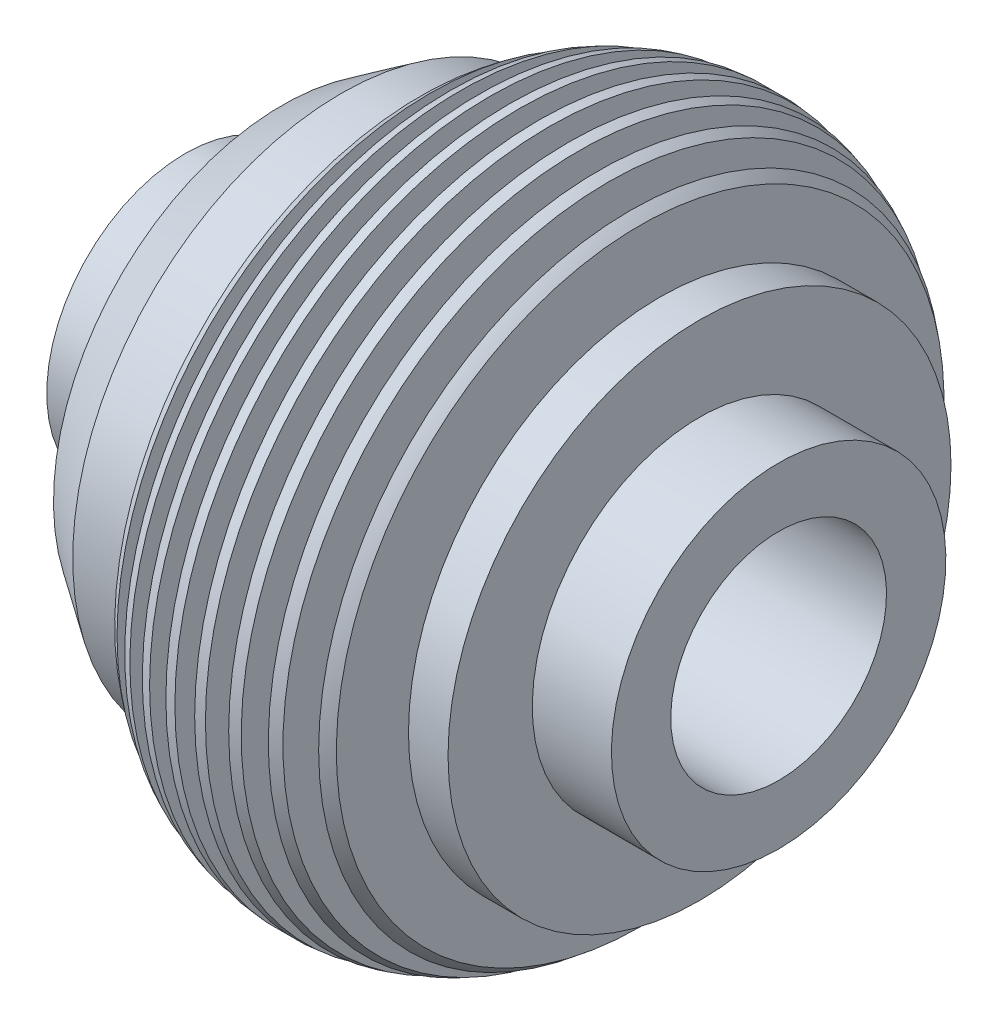
ISO-10303-21;
HEADER;
FILE_DESCRIPTION(('STEP AP214'),'2;1');
FILE_NAME('part.step','',(''),(''),'','','');
FILE_SCHEMA(('AUTOMOTIVE_DESIGN { 1 0 10303 214 1 1 1 1 }'));
ENDSEC;
DATA;
#1=APPLICATION_CONTEXT('core data for automotive mechanical design processes');
#2=APPLICATION_PROTOCOL_DEFINITION('international standard','automotive_design',2000,#1);
#3=PRODUCT_CONTEXT('',#1,'mechanical');
#4=PRODUCT('Part','Part','',(#3));
#5=PRODUCT_RELATED_PRODUCT_CATEGORY('part','',(#4));
#6=PRODUCT_DEFINITION_FORMATION('','',#4);
#7=PRODUCT_DEFINITION_CONTEXT('part definition',#1,'design');
#8=PRODUCT_DEFINITION('design','',#6,#7);
#9=PRODUCT_DEFINITION_SHAPE('','',#8);
#10=(LENGTH_UNIT() NAMED_UNIT(*) SI_UNIT(.MILLI.,.METRE.));
#11=(NAMED_UNIT(*) PLANE_ANGLE_UNIT() SI_UNIT($,.RADIAN.));
#12=(NAMED_UNIT(*) SI_UNIT($,.STERADIAN.) SOLID_ANGLE_UNIT());
#13=UNCERTAINTY_MEASURE_WITH_UNIT(LENGTH_MEASURE(1.E-05),#10,'distance_accuracy_value','');
#14=(GEOMETRIC_REPRESENTATION_CONTEXT(3) GLOBAL_UNCERTAINTY_ASSIGNED_CONTEXT((#13)) GLOBAL_UNIT_ASSIGNED_CONTEXT((#10,
#11,#12)) REPRESENTATION_CONTEXT('',''));
#15=CARTESIAN_POINT('',(0.,0.,0.));
#16=DIRECTION('',(0.,0.,1.));
#17=DIRECTION('',(1.,0.,0.));
#18=AXIS2_PLACEMENT_3D('',#15,#16,#17);
#19=CARTESIAN_POINT('',(-25.4836050641212,0.,0.));
#20=DIRECTION('',(1.,0.,0.));
#21=DIRECTION('',(0.,1.,0.));
#22=AXIS2_PLACEMENT_3D('',#19,#20,#21);
#23=PLANE('',#22);
#24=CARTESIAN_POINT('',(-25.4836050641212,-15.,0.));
#25=DIRECTION('',(-1.,0.,0.));
#26=DIRECTION('',(0.,-1.,0.));
#27=AXIS2_PLACEMENT_3D('',#24,#25,#26);
#28=CIRCLE('',#27,35.0000000000001);
#29=CARTESIAN_POINT('',(-25.4836050641212,-50.0000000000001,0.));
#30=VERTEX_POINT('',#29);
#31=EDGE_CURVE('E10',#30,#30,#28,.T.);
#32=ORIENTED_EDGE('',*,*,#31,.F.);
#33=EDGE_LOOP('',(#32));
#34=FACE_BOUND('',#33,.T.);
#35=CARTESIAN_POINT('',(-25.4836050641212,-15.,0.));
#36=DIRECTION('',(-1.,0.,0.));
#37=DIRECTION('',(0.,-1.,0.));
#38=AXIS2_PLACEMENT_3D('',#35,#36,#37);
#39=CIRCLE('',#38,57.8180370500548);
#40=CARTESIAN_POINT('',(-25.4836050641212,-72.8180370500548,0.));
#41=VERTEX_POINT('',#40);
#42=EDGE_CURVE('E191',#41,#41,#39,.T.);
#43=ORIENTED_EDGE('',*,*,#42,.T.);
#44=EDGE_LOOP('',(#43));
#45=FACE_BOUND('',#44,.T.);
#46=ADVANCED_FACE('F37',(#34,#45),#23,.F.);
#47=CARTESIAN_POINT('',(-35.4836050641212,-15.,0.));
#48=DIRECTION('',(-1.,0.,0.));
#49=DIRECTION('',(0.,-1.,0.));
#50=AXIS2_PLACEMENT_3D('',#47,#48,#49);
#51=TOROIDAL_SURFACE('',#50,35.,10.);
#52=CARTESIAN_POINT('',(-35.4836050641212,-15.,0.));
#53=DIRECTION('',(-1.,0.,0.));
#54=DIRECTION('',(0.,-1.,0.));
#55=AXIS2_PLACEMENT_3D('',#52,#53,#54);
#56=CIRCLE('',#55,25.);
#57=CARTESIAN_POINT('',(-35.4836050641212,-40.,0.));
#58=VERTEX_POINT('',#57);
#59=EDGE_CURVE('E43',#58,#58,#56,.T.);
#60=ORIENTED_EDGE('',*,*,#59,.F.);
#61=EDGE_LOOP('',(#60));
#62=FACE_BOUND('',#61,.T.);
#63=ORIENTED_EDGE('',*,*,#31,.T.);
#64=EDGE_LOOP('',(#63));
#65=FACE_BOUND('',#64,.T.);
#66=ADVANCED_FACE('F298',(#62,#65),#51,.F.);
#67=CARTESIAN_POINT('',(-50.,-15.,0.));
#68=DIRECTION('',(-1.,0.,0.));
#69=DIRECTION('',(0.,-1.,0.));
#70=AXIS2_PLACEMENT_3D('',#67,#68,#69);
#71=CYLINDRICAL_SURFACE('',#70,25.);
#72=CARTESIAN_POINT('',(-40.,-15.,0.));
#73=DIRECTION('',(-1.,0.,0.));
#74=DIRECTION('',(0.,-1.,0.));
#75=AXIS2_PLACEMENT_3D('',#72,#73,#74);
#76=CIRCLE('',#75,25.);
#77=CARTESIAN_POINT('',(-40.,-40.,0.));
#78=VERTEX_POINT('',#77);
#79=EDGE_CURVE('E47',#78,#78,#76,.T.);
#80=ORIENTED_EDGE('',*,*,#79,.F.);
#81=EDGE_LOOP('',(#80));
#82=FACE_BOUND('',#81,.T.);
#83=ORIENTED_EDGE('',*,*,#59,.T.);
#84=EDGE_LOOP('',(#83));
#85=FACE_BOUND('',#84,.T.);
#86=ADVANCED_FACE('F303',(#82,#85),#71,.T.);
#87=CARTESIAN_POINT('',(-40.,0.,0.));
#88=DIRECTION('',(-1.,0.,0.));
#89=DIRECTION('',(0.,-1.,0.));
#90=AXIS2_PLACEMENT_3D('',#87,#88,#89);
#91=PLANE('',#90);
#92=CARTESIAN_POINT('',(-40.,-15.,0.));
#93=DIRECTION('',(-1.,0.,0.));
#94=DIRECTION('',(0.,-1.,0.));
#95=AXIS2_PLACEMENT_3D('',#92,#93,#94);
#96=CIRCLE('',#95,35.);
#97=CARTESIAN_POINT('',(-40.,-50.,0.));
#98=VERTEX_POINT('',#97);
#99=EDGE_CURVE('E51',#98,#98,#96,.T.);
#100=ORIENTED_EDGE('',*,*,#99,.F.);
#101=EDGE_LOOP('',(#100));
#102=FACE_BOUND('',#101,.T.);
#103=ORIENTED_EDGE('',*,*,#79,.T.);
#104=EDGE_LOOP('',(#103));
#105=FACE_BOUND('',#104,.T.);
#106=ADVANCED_FACE('F308',(#102,#105),#91,.F.);
#107=CARTESIAN_POINT('',(-50.,-15.,0.));
#108=DIRECTION('',(-1.,0.,0.));
#109=DIRECTION('',(0.,-1.,0.));
#110=AXIS2_PLACEMENT_3D('',#107,#108,#109);
#111=CYLINDRICAL_SURFACE('',#110,35.);
#112=CARTESIAN_POINT('',(-50.,-15.,0.));
#113=DIRECTION('',(-1.,0.,0.));
#114=DIRECTION('',(0.,-1.,0.));
#115=AXIS2_PLACEMENT_3D('',#112,#113,#114);
#116=CIRCLE('',#115,35.);
#117=CARTESIAN_POINT('',(-50.,-50.,0.));
#118=VERTEX_POINT('',#117);
#119=EDGE_CURVE('E56',#118,#118,#116,.T.);
#120=ORIENTED_EDGE('',*,*,#119,.F.);
#121=EDGE_LOOP('',(#120));
#122=FACE_BOUND('',#121,.T.);
#123=ORIENTED_EDGE('',*,*,#99,.T.);
#124=EDGE_LOOP('',(#123));
#125=FACE_BOUND('',#124,.T.);
#126=ADVANCED_FACE('F314',(#122,#125),#111,.T.);
#127=CARTESIAN_POINT('',(-50.,0.,0.));
#128=DIRECTION('',(1.,0.,0.));
#129=DIRECTION('',(0.,1.,0.));
#130=AXIS2_PLACEMENT_3D('',#127,#128,#129);
#131=PLANE('',#130);
#132=CARTESIAN_POINT('',(-50.,-15.,0.));
#133=DIRECTION('',(-1.,0.,0.));
#134=DIRECTION('',(0.,-1.,0.));
#135=AXIS2_PLACEMENT_3D('',#132,#133,#134);
#136=CIRCLE('',#135,15.);
#137=CARTESIAN_POINT('',(-50.,-30.,0.));
#138=VERTEX_POINT('',#137);
#139=EDGE_CURVE('E59',#138,#138,#136,.T.);
#140=ORIENTED_EDGE('',*,*,#139,.F.);
#141=EDGE_LOOP('',(#140));
#142=FACE_BOUND('',#141,.T.);
#143=ORIENTED_EDGE('',*,*,#119,.T.);
#144=EDGE_LOOP('',(#143));
#145=FACE_BOUND('',#144,.T.);
#146=ADVANCED_FACE('F318',(#142,#145),#131,.F.);
#147=CARTESIAN_POINT('',(-50.,-15.,0.));
#148=DIRECTION('',(-1.,0.,0.));
#149=DIRECTION('',(0.,-1.,0.));
#150=AXIS2_PLACEMENT_3D('',#147,#148,#149);
#151=CYLINDRICAL_SURFACE('',#150,15.);
#152=CARTESIAN_POINT('',(0.,-15.,0.));
#153=DIRECTION('',(-1.,0.,0.));
#154=DIRECTION('',(0.,-1.,0.));
#155=AXIS2_PLACEMENT_3D('',#152,#153,#154);
#156=CIRCLE('',#155,15.);
#157=CARTESIAN_POINT('',(0.,-30.,0.));
#158=VERTEX_POINT('',#157);
#159=EDGE_CURVE('E62',#158,#158,#156,.T.);
#160=ORIENTED_EDGE('',*,*,#159,.F.);
#161=EDGE_LOOP('',(#160));
#162=FACE_BOUND('',#161,.T.);
#163=ORIENTED_EDGE('',*,*,#139,.T.);
#164=EDGE_LOOP('',(#163));
#165=FACE_BOUND('',#164,.T.);
#166=ADVANCED_FACE('F322',(#162,#165),#151,.F.);
#167=CARTESIAN_POINT('',(0.,0.,0.));
#168=DIRECTION('',(-1.,0.,0.));
#169=DIRECTION('',(0.,-1.,0.));
#170=AXIS2_PLACEMENT_3D('',#167,#168,#169);
#171=PLANE('',#170);
#172=CARTESIAN_POINT('',(0.,-15.,0.));
#173=DIRECTION('',(-1.,0.,0.));
#174=DIRECTION('',(0.,-1.,0.));
#175=AXIS2_PLACEMENT_3D('',#172,#173,#174);
#176=CIRCLE('',#175,27.2699386503067);
#177=CARTESIAN_POINT('',(0.,-42.2699386503067,0.));
#178=VERTEX_POINT('',#177);
#179=EDGE_CURVE('E65',#178,#178,#176,.T.);
#180=ORIENTED_EDGE('',*,*,#179,.F.);
#181=EDGE_LOOP('',(#180));
#182=FACE_BOUND('',#181,.T.);
#183=ORIENTED_EDGE('',*,*,#159,.T.);
#184=EDGE_LOOP('',(#183));
#185=FACE_BOUND('',#184,.T.);
#186=ADVANCED_FACE('F326',(#182,#185),#171,.F.);
#187=CARTESIAN_POINT('',(-50.,-15.,0.));
#188=DIRECTION('',(-1.,0.,0.));
#189=DIRECTION('',(0.,-1.,0.));
#190=AXIS2_PLACEMENT_3D('',#187,#188,#189);
#191=CYLINDRICAL_SURFACE('',#190,27.2699386503067);
#192=CARTESIAN_POINT('',(100.,-15.,0.));
#193=DIRECTION('',(-1.,0.,0.));
#194=DIRECTION('',(0.,-1.,0.));
#195=AXIS2_PLACEMENT_3D('',#192,#193,#194);
#196=CIRCLE('',#195,27.2699386503067);
#197=CARTESIAN_POINT('',(100.,-42.2699386503067,0.));
#198=VERTEX_POINT('',#197);
#199=EDGE_CURVE('E68',#198,#198,#196,.T.);
#200=ORIENTED_EDGE('',*,*,#199,.F.);
#201=EDGE_LOOP('',(#200));
#202=FACE_BOUND('',#201,.T.);
#203=ORIENTED_EDGE('',*,*,#179,.T.);
#204=EDGE_LOOP('',(#203));
#205=FACE_BOUND('',#204,.T.);
#206=ADVANCED_FACE('F330',(#202,#205),#191,.F.);
#207=CARTESIAN_POINT('',(100.,0.,0.));
#208=DIRECTION('',(1.,0.,0.));
#209=DIRECTION('',(0.,1.,0.));
#210=AXIS2_PLACEMENT_3D('',#207,#208,#209);
#211=PLANE('',#210);
#212=ORIENTED_EDGE('',*,*,#199,.T.);
#213=EDGE_LOOP('',(#212));
#214=FACE_BOUND('',#213,.T.);
#215=CARTESIAN_POINT('',(100.,-15.,0.));
#216=DIRECTION('',(-1.,0.,0.));
#217=DIRECTION('',(0.,-1.,0.));
#218=AXIS2_PLACEMENT_3D('',#215,#216,#217);
#219=CIRCLE('',#218,42.2699386503067);
#220=CARTESIAN_POINT('',(100.,-57.2699386503067,0.));
#221=VERTEX_POINT('',#220);
#222=EDGE_CURVE('E71',#221,#221,#219,.T.);
#223=ORIENTED_EDGE('',*,*,#222,.F.);
#224=EDGE_LOOP('',(#223));
#225=FACE_BOUND('',#224,.T.);
#226=ADVANCED_FACE('F334',(#214,#225),#211,.T.);
#227=CARTESIAN_POINT('',(-50.,-15.,0.));
#228=DIRECTION('',(-1.,0.,0.));
#229=DIRECTION('',(0.,-1.,0.));
#230=AXIS2_PLACEMENT_3D('',#227,#228,#229);
#231=CYLINDRICAL_SURFACE('',#230,42.2699386503067);
#232=ORIENTED_EDGE('',*,*,#222,.T.);
#233=EDGE_LOOP('',(#232));
#234=FACE_BOUND('',#233,.T.);
#235=CARTESIAN_POINT('',(80.,-15.,0.));
#236=DIRECTION('',(-1.,0.,0.));
#237=DIRECTION('',(0.,-1.,0.));
#238=AXIS2_PLACEMENT_3D('',#235,#236,#237);
#239=CIRCLE('',#238,42.2699386503067);
#240=CARTESIAN_POINT('',(80.,-57.2699386503067,0.));
#241=VERTEX_POINT('',#240);
#242=EDGE_CURVE('E74',#241,#241,#239,.T.);
#243=ORIENTED_EDGE('',*,*,#242,.F.);
#244=EDGE_LOOP('',(#243));
#245=FACE_BOUND('',#244,.T.);
#246=ADVANCED_FACE('F338',(#234,#245),#231,.T.);
#247=CARTESIAN_POINT('',(80.,0.,0.));
#248=DIRECTION('',(1.,0.,0.));
#249=DIRECTION('',(0.,1.,0.));
#250=AXIS2_PLACEMENT_3D('',#247,#248,#249);
#251=PLANE('',#250);
#252=ORIENTED_EDGE('',*,*,#242,.T.);
#253=EDGE_LOOP('',(#252));
#254=FACE_BOUND('',#253,.T.);
#255=CARTESIAN_POINT('',(80.,-15.,0.));
#256=DIRECTION('',(-1.,0.,0.));
#257=DIRECTION('',(0.,-1.,0.));
#258=AXIS2_PLACEMENT_3D('',#255,#256,#257);
#259=CIRCLE('',#258,63.5699386503067);
#260=CARTESIAN_POINT('',(80.,-78.5699386503067,0.));
#261=VERTEX_POINT('',#260);
#262=EDGE_CURVE('E77',#261,#261,#259,.T.);
#263=ORIENTED_EDGE('',*,*,#262,.F.);
#264=EDGE_LOOP('',(#263));
#265=FACE_BOUND('',#264,.T.);
#266=ADVANCED_FACE('F342',(#254,#265),#251,.T.);
#267=CARTESIAN_POINT('',(-50.,-15.,0.));
#268=DIRECTION('',(-1.,0.,0.));
#269=DIRECTION('',(0.,-1.,0.));
#270=AXIS2_PLACEMENT_3D('',#267,#268,#269);
#271=CYLINDRICAL_SURFACE('',#270,63.5699386503067);
#272=ORIENTED_EDGE('',*,*,#262,.T.);
#273=EDGE_LOOP('',(#272));
#274=FACE_BOUND('',#273,.T.);
#275=CARTESIAN_POINT('',(70.,-15.,0.));
#276=DIRECTION('',(-1.,0.,0.));
#277=DIRECTION('',(0.,-1.,0.));
#278=AXIS2_PLACEMENT_3D('',#275,#276,#277);
#279=CIRCLE('',#278,63.5699386503067);
#280=CARTESIAN_POINT('',(70.,-78.5699386503067,0.));
#281=VERTEX_POINT('',#280);
#282=EDGE_CURVE('E80',#281,#281,#279,.T.);
#283=ORIENTED_EDGE('',*,*,#282,.F.);
#284=EDGE_LOOP('',(#283));
#285=FACE_BOUND('',#284,.T.);
#286=ADVANCED_FACE('F346',(#274,#285),#271,.T.);
#287=CARTESIAN_POINT('',(70.,0.,0.));
#288=DIRECTION('',(-1.,0.,0.));
#289=DIRECTION('',(0.,-1.,0.));
#290=AXIS2_PLACEMENT_3D('',#287,#288,#289);
#291=PLANE('',#290);
#292=ORIENTED_EDGE('',*,*,#282,.T.);
#293=EDGE_LOOP('',(#292));
#294=FACE_BOUND('',#293,.T.);
#295=CARTESIAN_POINT('',(70.,-15.,0.));
#296=DIRECTION('',(-1.,0.,0.));
#297=DIRECTION('',(0.,-1.,0.));
#298=AXIS2_PLACEMENT_3D('',#295,#296,#297);
#299=CIRCLE('',#298,43.8266123800131);
#300=CARTESIAN_POINT('',(70.,-58.826612380013,0.));
#301=VERTEX_POINT('',#300);
#302=EDGE_CURVE('E83',#301,#301,#299,.T.);
#303=ORIENTED_EDGE('',*,*,#302,.F.);
#304=EDGE_LOOP('',(#303));
#305=FACE_BOUND('',#304,.T.);
#306=ADVANCED_FACE('F350',(#294,#305),#291,.T.);
#307=CARTESIAN_POINT('',(-50.,-15.,0.));
#308=DIRECTION('',(-1.,0.,0.));
#309=DIRECTION('',(0.,-1.,0.));
#310=AXIS2_PLACEMENT_3D('',#307,#308,#309);
#311=CYLINDRICAL_SURFACE('',#310,43.8266123800131);
#312=ORIENTED_EDGE('',*,*,#302,.T.);
#313=EDGE_LOOP('',(#312));
#314=FACE_BOUND('',#313,.T.);
#315=CARTESIAN_POINT('',(65.,-15.,0.));
#316=DIRECTION('',(-1.,0.,0.));
#317=DIRECTION('',(0.,-1.,0.));
#318=AXIS2_PLACEMENT_3D('',#315,#316,#317);
#319=CIRCLE('',#318,43.8266123800131);
#320=CARTESIAN_POINT('',(65.,-58.826612380013,0.));
#321=VERTEX_POINT('',#320);
#322=EDGE_CURVE('E86',#321,#321,#319,.T.);
#323=ORIENTED_EDGE('',*,*,#322,.F.);
#324=EDGE_LOOP('',(#323));
#325=FACE_BOUND('',#324,.T.);
#326=ADVANCED_FACE('F354',(#314,#325),#311,.T.);
#327=CARTESIAN_POINT('',(65.,0.,0.));
#328=DIRECTION('',(1.,0.,0.));
#329=DIRECTION('',(0.,1.,0.));
#330=AXIS2_PLACEMENT_3D('',#327,#328,#329);
#331=PLANE('',#330);
#332=ORIENTED_EDGE('',*,*,#322,.T.);
#333=EDGE_LOOP('',(#332));
#334=FACE_BOUND('',#333,.T.);
#335=CARTESIAN_POINT('',(65.,-15.,0.));
#336=DIRECTION('',(-1.,0.,0.));
#337=DIRECTION('',(0.,-1.,0.));
#338=AXIS2_PLACEMENT_3D('',#335,#336,#337);
#339=CIRCLE('',#338,76.8034872657739);
#340=CARTESIAN_POINT('',(65.,-91.8034872657739,0.));
#341=VERTEX_POINT('',#340);
#342=EDGE_CURVE('E89',#341,#341,#339,.T.);
#343=ORIENTED_EDGE('',*,*,#342,.F.);
#344=EDGE_LOOP('',(#343));
#345=FACE_BOUND('',#344,.T.);
#346=ADVANCED_FACE('F358',(#334,#345),#331,.T.);
#347=CARTESIAN_POINT('',(36.9390712418696,-15.,0.));
#348=DIRECTION('',(-1.,0.,0.));
#349=DIRECTION('',(0.,-1.,0.));
#350=AXIS2_PLACEMENT_3D('',#347,#348,#349);
#351=TOROIDAL_SURFACE('',#350,43.826612380013,43.3);
#352=CARTESIAN_POINT('',(62.5,-15.,0.));
#353=DIRECTION('',(-1.,0.,0.));
#354=DIRECTION('',(0.,-1.,0.));
#355=AXIS2_PLACEMENT_3D('',#352,#353,#354);
#356=CIRCLE('',#355,78.7769903611133);
#357=CARTESIAN_POINT('',(62.5,-93.7769903611133,0.));
#358=VERTEX_POINT('',#357);
#359=EDGE_CURVE('E92',#358,#358,#356,.T.);
#360=ORIENTED_EDGE('',*,*,#359,.F.);
#361=EDGE_LOOP('',(#360));
#362=FACE_BOUND('',#361,.T.);
#363=ORIENTED_EDGE('',*,*,#342,.T.);
#364=EDGE_LOOP('',(#363));
#365=FACE_BOUND('',#364,.T.);
#366=ADVANCED_FACE('F362',(#362,#365),#351,.T.);
#367=CARTESIAN_POINT('',(62.5,0.,0.));
#368=DIRECTION('',(-1.,0.,0.));
#369=DIRECTION('',(0.,-1.,0.));
#370=AXIS2_PLACEMENT_3D('',#367,#368,#369);
#371=PLANE('',#370);
#372=ORIENTED_EDGE('',*,*,#359,.T.);
#373=EDGE_LOOP('',(#372));
#374=FACE_BOUND('',#373,.T.);
#375=CARTESIAN_POINT('',(62.5,-15.,0.));
#376=DIRECTION('',(-1.,0.,0.));
#377=DIRECTION('',(0.,-1.,0.));
#378=AXIS2_PLACEMENT_3D('',#375,#376,#377);
#379=CIRCLE('',#378,43.826612380013);
#380=CARTESIAN_POINT('',(62.5,-58.826612380013,0.));
#381=VERTEX_POINT('',#380);
#382=EDGE_CURVE('E95',#381,#381,#379,.T.);
#383=ORIENTED_EDGE('',*,*,#382,.F.);
#384=EDGE_LOOP('',(#383));
#385=FACE_BOUND('',#384,.T.);
#386=ADVANCED_FACE('F366',(#374,#385),#371,.T.);
#387=CARTESIAN_POINT('',(-50.,-15.,0.));
#388=DIRECTION('',(-1.,0.,0.));
#389=DIRECTION('',(0.,-1.,0.));
#390=AXIS2_PLACEMENT_3D('',#387,#388,#389);
#391=CYLINDRICAL_SURFACE('',#390,43.826612380013);
#392=ORIENTED_EDGE('',*,*,#382,.T.);
#393=EDGE_LOOP('',(#392));
#394=FACE_BOUND('',#393,.T.);
#395=CARTESIAN_POINT('',(56.9390712418696,-15.,0.));
#396=DIRECTION('',(-1.,0.,0.));
#397=DIRECTION('',(0.,-1.,0.));
#398=AXIS2_PLACEMENT_3D('',#395,#396,#397);
#399=CIRCLE('',#398,43.826612380013);
#400=CARTESIAN_POINT('',(56.9390712418696,-58.826612380013,0.));
#401=VERTEX_POINT('',#400);
#402=EDGE_CURVE('E98',#401,#401,#399,.T.);
#403=ORIENTED_EDGE('',*,*,#402,.F.);
#404=EDGE_LOOP('',(#403));
#405=FACE_BOUND('',#404,.T.);
#406=ADVANCED_FACE('F370',(#394,#405),#391,.T.);
#407=CARTESIAN_POINT('',(56.9390712418695,0.,0.));
#408=DIRECTION('',(1.,0.,0.));
#409=DIRECTION('',(0.,1.,0.));
#410=AXIS2_PLACEMENT_3D('',#407,#408,#409);
#411=PLANE('',#410);
#412=ORIENTED_EDGE('',*,*,#402,.T.);
#413=EDGE_LOOP('',(#412));
#414=FACE_BOUND('',#413,.T.);
#415=CARTESIAN_POINT('',(56.9390712418696,-15.,0.));
#416=DIRECTION('',(-1.,0.,0.));
#417=DIRECTION('',(0.,-1.,0.));
#418=AXIS2_PLACEMENT_3D('',#415,#416,#417);
#419=CIRCLE('',#418,82.2309090146345);
#420=CARTESIAN_POINT('',(56.9390712418696,-97.2309090146345,0.));
#421=VERTEX_POINT('',#420);
#422=EDGE_CURVE('E101',#421,#421,#419,.T.);
#423=ORIENTED_EDGE('',*,*,#422,.F.);
#424=EDGE_LOOP('',(#423));
#425=FACE_BOUND('',#424,.T.);
#426=ADVANCED_FACE('F374',(#414,#425),#411,.T.);
#427=CARTESIAN_POINT('',(36.9390712418696,-15.,0.));
#428=DIRECTION('',(-1.,0.,0.));
#429=DIRECTION('',(0.,-1.,0.));
#430=AXIS2_PLACEMENT_3D('',#427,#428,#429);
#431=TOROIDAL_SURFACE('',#430,43.826612380013,43.3);
#432=CARTESIAN_POINT('',(54.4390712418695,-15.,0.));
#433=DIRECTION('',(-1.,0.,0.));
#434=DIRECTION('',(0.,-1.,0.));
#435=AXIS2_PLACEMENT_3D('',#432,#433,#434);
#436=CIRCLE('',#435,83.43267252237);
#437=CARTESIAN_POINT('',(54.4390712418695,-98.43267252237,0.));
#438=VERTEX_POINT('',#437);
#439=EDGE_CURVE('E104',#438,#438,#436,.T.);
#440=ORIENTED_EDGE('',*,*,#439,.F.);
#441=EDGE_LOOP('',(#440));
#442=FACE_BOUND('',#441,.T.);
#443=ORIENTED_EDGE('',*,*,#422,.T.);
#444=EDGE_LOOP('',(#443));
#445=FACE_BOUND('',#444,.T.);
#446=ADVANCED_FACE('F378',(#442,#445),#431,.T.);
#447=CARTESIAN_POINT('',(54.4390712418695,0.,0.));
#448=DIRECTION('',(-1.,0.,0.));
#449=DIRECTION('',(0.,-1.,0.));
#450=AXIS2_PLACEMENT_3D('',#447,#448,#449);
#451=PLANE('',#450);
#452=ORIENTED_EDGE('',*,*,#439,.T.);
#453=EDGE_LOOP('',(#452));
#454=FACE_BOUND('',#453,.T.);
#455=CARTESIAN_POINT('',(54.4390712418695,-15.,0.));
#456=DIRECTION('',(-1.,0.,0.));
#457=DIRECTION('',(0.,-1.,0.));
#458=AXIS2_PLACEMENT_3D('',#455,#456,#457);
#459=CIRCLE('',#458,43.826612380013);
#460=CARTESIAN_POINT('',(54.4390712418695,-58.826612380013,0.));
#461=VERTEX_POINT('',#460);
#462=EDGE_CURVE('E107',#461,#461,#459,.T.);
#463=ORIENTED_EDGE('',*,*,#462,.F.);
#464=EDGE_LOOP('',(#463));
#465=FACE_BOUND('',#464,.T.);
#466=ADVANCED_FACE('F382',(#454,#465),#451,.T.);
#467=CARTESIAN_POINT('',(-50.,-15.,0.));
#468=DIRECTION('',(-1.,0.,0.));
#469=DIRECTION('',(0.,-1.,0.));
#470=AXIS2_PLACEMENT_3D('',#467,#468,#469);
#471=CYLINDRICAL_SURFACE('',#470,43.826612380013);
#472=ORIENTED_EDGE('',*,*,#462,.T.);
#473=EDGE_LOOP('',(#472));
#474=FACE_BOUND('',#473,.T.);
#475=CARTESIAN_POINT('',(49.4390712418695,-15.,0.));
#476=DIRECTION('',(-1.,0.,0.));
#477=DIRECTION('',(0.,-1.,0.));
#478=AXIS2_PLACEMENT_3D('',#475,#476,#477);
#479=CIRCLE('',#478,43.826612380013);
#480=CARTESIAN_POINT('',(49.4390712418695,-58.826612380013,0.));
#481=VERTEX_POINT('',#480);
#482=EDGE_CURVE('E110',#481,#481,#479,.T.);
#483=ORIENTED_EDGE('',*,*,#482,.F.);
#484=EDGE_LOOP('',(#483));
#485=FACE_BOUND('',#484,.T.);
#486=ADVANCED_FACE('F386',(#474,#485),#471,.T.);
#487=CARTESIAN_POINT('',(49.4390712418695,0.,0.));
#488=DIRECTION('',(1.,0.,0.));
#489=DIRECTION('',(0.,1.,0.));
#490=AXIS2_PLACEMENT_3D('',#487,#488,#489);
#491=PLANE('',#490);
#492=ORIENTED_EDGE('',*,*,#482,.T.);
#493=EDGE_LOOP('',(#492));
#494=FACE_BOUND('',#493,.T.);
#495=CARTESIAN_POINT('',(49.4390712418695,-15.,0.));
#496=DIRECTION('',(-1.,0.,0.));
#497=DIRECTION('',(0.,-1.,0.));
#498=AXIS2_PLACEMENT_3D('',#495,#496,#497);
#499=CIRCLE('',#498,85.2830955883123);
#500=CARTESIAN_POINT('',(49.4390712418695,-100.283095588312,0.));
#501=VERTEX_POINT('',#500);
#502=EDGE_CURVE('E113',#501,#501,#499,.T.);
#503=ORIENTED_EDGE('',*,*,#502,.F.);
#504=EDGE_LOOP('',(#503));
#505=FACE_BOUND('',#504,.T.);
#506=ADVANCED_FACE('F390',(#494,#505),#491,.T.);
#507=CARTESIAN_POINT('',(36.9390712418696,-15.,0.));
#508=DIRECTION('',(-1.,0.,0.));
#509=DIRECTION('',(0.,-1.,0.));
#510=AXIS2_PLACEMENT_3D('',#507,#508,#509);
#511=TOROIDAL_SURFACE('',#510,43.826612380013,43.3);
#512=CARTESIAN_POINT('',(46.9390712418695,-15.,0.));
#513=DIRECTION('',(-1.,0.,0.));
#514=DIRECTION('',(0.,-1.,0.));
#515=AXIS2_PLACEMENT_3D('',#512,#513,#514);
#516=CIRCLE('',#515,85.9560557658448);
#517=CARTESIAN_POINT('',(46.9390712418695,-100.956055765845,0.));
#518=VERTEX_POINT('',#517);
#519=EDGE_CURVE('E116',#518,#518,#516,.T.);
#520=ORIENTED_EDGE('',*,*,#519,.F.);
#521=EDGE_LOOP('',(#520));
#522=FACE_BOUND('',#521,.T.);
#523=ORIENTED_EDGE('',*,*,#502,.T.);
#524=EDGE_LOOP('',(#523));
#525=FACE_BOUND('',#524,.T.);
#526=ADVANCED_FACE('F394',(#522,#525),#511,.T.);
#527=CARTESIAN_POINT('',(46.9390712418695,0.,0.));
#528=DIRECTION('',(-1.,0.,0.));
#529=DIRECTION('',(0.,-1.,0.));
#530=AXIS2_PLACEMENT_3D('',#527,#528,#529);
#531=PLANE('',#530);
#532=ORIENTED_EDGE('',*,*,#519,.T.);
#533=EDGE_LOOP('',(#532));
#534=FACE_BOUND('',#533,.T.);
#535=CARTESIAN_POINT('',(46.9390712418695,-15.,0.));
#536=DIRECTION('',(-1.,0.,0.));
#537=DIRECTION('',(0.,-1.,0.));
#538=AXIS2_PLACEMENT_3D('',#535,#536,#537);
#539=CIRCLE('',#538,43.826612380013);
#540=CARTESIAN_POINT('',(46.9390712418695,-58.826612380013,0.));
#541=VERTEX_POINT('',#540);
#542=EDGE_CURVE('E119',#541,#541,#539,.T.);
#543=ORIENTED_EDGE('',*,*,#542,.F.);
#544=EDGE_LOOP('',(#543));
#545=FACE_BOUND('',#544,.T.);
#546=ADVANCED_FACE('F398',(#534,#545),#531,.T.);
#547=CARTESIAN_POINT('',(-50.,-15.,0.));
#548=DIRECTION('',(-1.,0.,0.));
#549=DIRECTION('',(0.,-1.,0.));
#550=AXIS2_PLACEMENT_3D('',#547,#548,#549);
#551=CYLINDRICAL_SURFACE('',#550,43.826612380013);
#552=ORIENTED_EDGE('',*,*,#542,.T.);
#553=EDGE_LOOP('',(#552));
#554=FACE_BOUND('',#553,.T.);
#555=CARTESIAN_POINT('',(41.9390712418696,-15.,0.));
#556=DIRECTION('',(-1.,0.,0.));
#557=DIRECTION('',(0.,-1.,0.));
#558=AXIS2_PLACEMENT_3D('',#555,#556,#557);
#559=CIRCLE('',#558,43.826612380013);
#560=CARTESIAN_POINT('',(41.9390712418696,-58.826612380013,0.));
#561=VERTEX_POINT('',#560);
#562=EDGE_CURVE('E122',#561,#561,#559,.T.);
#563=ORIENTED_EDGE('',*,*,#562,.F.);
#564=EDGE_LOOP('',(#563));
#565=FACE_BOUND('',#564,.T.);
#566=ADVANCED_FACE('F402',(#554,#565),#551,.T.);
#567=CARTESIAN_POINT('',(41.9390712418695,0.,0.));
#568=DIRECTION('',(1.,0.,0.));
#569=DIRECTION('',(0.,1.,0.));
#570=AXIS2_PLACEMENT_3D('',#567,#568,#569);
#571=PLANE('',#570);
#572=ORIENTED_EDGE('',*,*,#562,.T.);
#573=EDGE_LOOP('',(#572));
#574=FACE_BOUND('',#573,.T.);
#575=CARTESIAN_POINT('',(41.9390712418695,-15.,0.));
#576=DIRECTION('',(-1.,0.,0.));
#577=DIRECTION('',(0.,-1.,0.));
#578=AXIS2_PLACEMENT_3D('',#575,#576,#577);
#579=CIRCLE('',#578,86.8369599721914);
#580=CARTESIAN_POINT('',(41.9390712418695,-101.836959972191,0.));
#581=VERTEX_POINT('',#580);
#582=EDGE_CURVE('E125',#581,#581,#579,.T.);
#583=ORIENTED_EDGE('',*,*,#582,.F.);
#584=EDGE_LOOP('',(#583));
#585=FACE_BOUND('',#584,.T.);
#586=ADVANCED_FACE('F406',(#574,#585),#571,.T.);
#587=CARTESIAN_POINT('',(36.9390712418696,-15.,0.));
#588=DIRECTION('',(-1.,0.,0.));
#589=DIRECTION('',(0.,-1.,0.));
#590=AXIS2_PLACEMENT_3D('',#587,#588,#589);
#591=TOROIDAL_SURFACE('',#590,43.826612380013,43.3);
#592=CARTESIAN_POINT('',(39.4390712418695,-15.,0.));
#593=DIRECTION('',(-1.,0.,0.));
#594=DIRECTION('',(0.,-1.,0.));
#595=AXIS2_PLACEMENT_3D('',#592,#593,#594);
#596=CIRCLE('',#595,87.0543812329159);
#597=CARTESIAN_POINT('',(39.4390712418695,-102.054381232916,0.));
#598=VERTEX_POINT('',#597);
#599=EDGE_CURVE('E128',#598,#598,#596,.T.);
#600=ORIENTED_EDGE('',*,*,#599,.F.);
#601=EDGE_LOOP('',(#600));
#602=FACE_BOUND('',#601,.T.);
#603=ORIENTED_EDGE('',*,*,#582,.T.);
#604=EDGE_LOOP('',(#603));
#605=FACE_BOUND('',#604,.T.);
#606=ADVANCED_FACE('F410',(#602,#605),#591,.T.);
#607=CARTESIAN_POINT('',(39.4390712418695,0.,0.));
#608=DIRECTION('',(-1.,0.,0.));
#609=DIRECTION('',(0.,-1.,0.));
#610=AXIS2_PLACEMENT_3D('',#607,#608,#609);
#611=PLANE('',#610);
#612=ORIENTED_EDGE('',*,*,#599,.T.);
#613=EDGE_LOOP('',(#612));
#614=FACE_BOUND('',#613,.T.);
#615=CARTESIAN_POINT('',(39.4390712418695,-15.,0.));
#616=DIRECTION('',(-1.,0.,0.));
#617=DIRECTION('',(0.,-1.,0.));
#618=AXIS2_PLACEMENT_3D('',#615,#616,#617);
#619=CIRCLE('',#618,43.826612380013);
#620=CARTESIAN_POINT('',(39.4390712418695,-58.826612380013,0.));
#621=VERTEX_POINT('',#620);
#622=EDGE_CURVE('E131',#621,#621,#619,.T.);
#623=ORIENTED_EDGE('',*,*,#622,.F.);
#624=EDGE_LOOP('',(#623));
#625=FACE_BOUND('',#624,.T.);
#626=ADVANCED_FACE('F414',(#614,#625),#611,.T.);
#627=CARTESIAN_POINT('',(-50.,-15.,0.));
#628=DIRECTION('',(-1.,0.,0.));
#629=DIRECTION('',(0.,-1.,0.));
#630=AXIS2_PLACEMENT_3D('',#627,#628,#629);
#631=CYLINDRICAL_SURFACE('',#630,43.826612380013);
#632=ORIENTED_EDGE('',*,*,#622,.T.);
#633=EDGE_LOOP('',(#632));
#634=FACE_BOUND('',#633,.T.);
#635=CARTESIAN_POINT('',(34.4390712418696,-15.,0.));
#636=DIRECTION('',(-1.,0.,0.));
#637=DIRECTION('',(0.,-1.,0.));
#638=AXIS2_PLACEMENT_3D('',#635,#636,#637);
#639=CIRCLE('',#638,43.826612380013);
#640=CARTESIAN_POINT('',(34.4390712418696,-58.826612380013,0.));
#641=VERTEX_POINT('',#640);
#642=EDGE_CURVE('E134',#641,#641,#639,.T.);
#643=ORIENTED_EDGE('',*,*,#642,.F.);
#644=EDGE_LOOP('',(#643));
#645=FACE_BOUND('',#644,.T.);
#646=ADVANCED_FACE('F418',(#634,#645),#631,.T.);
#647=CARTESIAN_POINT('',(34.4390712418696,0.,0.));
#648=DIRECTION('',(1.,0.,0.));
#649=DIRECTION('',(0.,1.,0.));
#650=AXIS2_PLACEMENT_3D('',#647,#648,#649);
#651=PLANE('',#650);
#652=ORIENTED_EDGE('',*,*,#642,.T.);
#653=EDGE_LOOP('',(#652));
#654=FACE_BOUND('',#653,.T.);
#655=CARTESIAN_POINT('',(34.4390712418696,-15.,0.));
#656=DIRECTION('',(-1.,0.,0.));
#657=DIRECTION('',(0.,-1.,0.));
#658=AXIS2_PLACEMENT_3D('',#655,#656,#657);
#659=CIRCLE('',#658,87.0543812329159);
#660=CARTESIAN_POINT('',(34.4390712418696,-102.054381232916,0.));
#661=VERTEX_POINT('',#660);
#662=EDGE_CURVE('E137',#661,#661,#659,.T.);
#663=ORIENTED_EDGE('',*,*,#662,.F.);
#664=EDGE_LOOP('',(#663));
#665=FACE_BOUND('',#664,.T.);
#666=ADVANCED_FACE('F422',(#654,#665),#651,.T.);
#667=CARTESIAN_POINT('',(36.9390712418696,-15.,0.));
#668=DIRECTION('',(-1.,0.,0.));
#669=DIRECTION('',(0.,-1.,0.));
#670=AXIS2_PLACEMENT_3D('',#667,#668,#669);
#671=TOROIDAL_SURFACE('',#670,43.826612380013,43.3);
#672=CARTESIAN_POINT('',(31.9390712418696,-15.,0.));
#673=DIRECTION('',(-1.,0.,0.));
#674=DIRECTION('',(0.,-1.,0.));
#675=AXIS2_PLACEMENT_3D('',#672,#673,#674);
#676=CIRCLE('',#675,86.8369599721914);
#677=CARTESIAN_POINT('',(31.9390712418696,-101.836959972191,0.));
#678=VERTEX_POINT('',#677);
#679=EDGE_CURVE('E140',#678,#678,#676,.T.);
#680=ORIENTED_EDGE('',*,*,#679,.F.);
#681=EDGE_LOOP('',(#680));
#682=FACE_BOUND('',#681,.T.);
#683=ORIENTED_EDGE('',*,*,#662,.T.);
#684=EDGE_LOOP('',(#683));
#685=FACE_BOUND('',#684,.T.);
#686=ADVANCED_FACE('F294',(#682,#685),#671,.T.);
#687=CARTESIAN_POINT('',(31.9390712418696,0.,0.));
#688=DIRECTION('',(-1.,0.,0.));
#689=DIRECTION('',(0.,-1.,0.));
#690=AXIS2_PLACEMENT_3D('',#687,#688,#689);
#691=PLANE('',#690);
#692=ORIENTED_EDGE('',*,*,#679,.T.);
#693=EDGE_LOOP('',(#692));
#694=FACE_BOUND('',#693,.T.);
#695=CARTESIAN_POINT('',(31.9390712418696,-15.,0.));
#696=DIRECTION('',(-1.,0.,0.));
#697=DIRECTION('',(0.,-1.,0.));
#698=AXIS2_PLACEMENT_3D('',#695,#696,#697);
#699=CIRCLE('',#698,43.826612380013);
#700=CARTESIAN_POINT('',(31.9390712418696,-58.826612380013,0.));
#701=VERTEX_POINT('',#700);
#702=EDGE_CURVE('E143',#701,#701,#699,.T.);
#703=ORIENTED_EDGE('',*,*,#702,.F.);
#704=EDGE_LOOP('',(#703));
#705=FACE_BOUND('',#704,.T.);
#706=ADVANCED_FACE('F288',(#694,#705),#691,.T.);
#707=CARTESIAN_POINT('',(-50.,-15.,0.));
#708=DIRECTION('',(-1.,0.,0.));
#709=DIRECTION('',(0.,-1.,0.));
#710=AXIS2_PLACEMENT_3D('',#707,#708,#709);
#711=CYLINDRICAL_SURFACE('',#710,43.826612380013);
#712=ORIENTED_EDGE('',*,*,#702,.T.);
#713=EDGE_LOOP('',(#712));
#714=FACE_BOUND('',#713,.T.);
#715=CARTESIAN_POINT('',(26.9390712418696,-15.,0.));
#716=DIRECTION('',(-1.,0.,0.));
#717=DIRECTION('',(0.,-1.,0.));
#718=AXIS2_PLACEMENT_3D('',#715,#716,#717);
#719=CIRCLE('',#718,43.826612380013);
#720=CARTESIAN_POINT('',(26.9390712418696,-58.826612380013,0.));
#721=VERTEX_POINT('',#720);
#722=EDGE_CURVE('E146',#721,#721,#719,.T.);
#723=ORIENTED_EDGE('',*,*,#722,.F.);
#724=EDGE_LOOP('',(#723));
#725=FACE_BOUND('',#724,.T.);
#726=ADVANCED_FACE('F283',(#714,#725),#711,.T.);
#727=CARTESIAN_POINT('',(26.9390712418696,0.,0.));
#728=DIRECTION('',(-1.,0.,0.));
#729=DIRECTION('',(0.,-1.,0.));
#730=AXIS2_PLACEMENT_3D('',#727,#728,#729);
#731=PLANE('',#730);
#732=CARTESIAN_POINT('',(26.9390712418696,-15.,0.));
#733=DIRECTION('',(-1.,0.,0.));
#734=DIRECTION('',(0.,-1.,0.));
#735=AXIS2_PLACEMENT_3D('',#732,#733,#734);
#736=CIRCLE('',#735,85.9560557658447);
#737=CARTESIAN_POINT('',(26.9390712418696,-100.956055765845,0.));
#738=VERTEX_POINT('',#737);
#739=EDGE_CURVE('E149',#738,#738,#736,.T.);
#740=ORIENTED_EDGE('',*,*,#739,.F.);
#741=EDGE_LOOP('',(#740));
#742=FACE_BOUND('',#741,.T.);
#743=ORIENTED_EDGE('',*,*,#722,.T.);
#744=EDGE_LOOP('',(#743));
#745=FACE_BOUND('',#744,.T.);
#746=ADVANCED_FACE('F277',(#742,#745),#731,.F.);
#747=CARTESIAN_POINT('',(36.9390712418696,-15.,0.));
#748=DIRECTION('',(-1.,0.,0.));
#749=DIRECTION('',(0.,-1.,0.));
#750=AXIS2_PLACEMENT_3D('',#747,#748,#749);
#751=TOROIDAL_SURFACE('',#750,43.826612380013,43.3);
#752=CARTESIAN_POINT('',(24.4390712418696,-15.,0.));
#753=DIRECTION('',(-1.,0.,0.));
#754=DIRECTION('',(0.,-1.,0.));
#755=AXIS2_PLACEMENT_3D('',#752,#753,#754);
#756=CIRCLE('',#755,85.2830955883123);
#757=CARTESIAN_POINT('',(24.4390712418696,-100.283095588312,0.));
#758=VERTEX_POINT('',#757);
#759=EDGE_CURVE('E152',#758,#758,#756,.T.);
#760=ORIENTED_EDGE('',*,*,#759,.F.);
#761=EDGE_LOOP('',(#760));
#762=FACE_BOUND('',#761,.T.);
#763=ORIENTED_EDGE('',*,*,#739,.T.);
#764=EDGE_LOOP('',(#763));
#765=FACE_BOUND('',#764,.T.);
#766=ADVANCED_FACE('F271',(#762,#765),#751,.T.);
#767=CARTESIAN_POINT('',(24.4390712418696,0.,0.));
#768=DIRECTION('',(1.,0.,0.));
#769=DIRECTION('',(0.,1.,0.));
#770=AXIS2_PLACEMENT_3D('',#767,#768,#769);
#771=PLANE('',#770);
#772=CARTESIAN_POINT('',(24.4390712418696,-15.,0.));
#773=DIRECTION('',(-1.,0.,0.));
#774=DIRECTION('',(0.,-1.,0.));
#775=AXIS2_PLACEMENT_3D('',#772,#773,#774);
#776=CIRCLE('',#775,43.8266123800131);
#777=CARTESIAN_POINT('',(24.4390712418696,-58.826612380013,0.));
#778=VERTEX_POINT('',#777);
#779=EDGE_CURVE('E155',#778,#778,#776,.T.);
#780=ORIENTED_EDGE('',*,*,#779,.F.);
#781=EDGE_LOOP('',(#780));
#782=FACE_BOUND('',#781,.T.);
#783=ORIENTED_EDGE('',*,*,#759,.T.);
#784=EDGE_LOOP('',(#783));
#785=FACE_BOUND('',#784,.T.);
#786=ADVANCED_FACE('F265',(#782,#785),#771,.F.);
#787=CARTESIAN_POINT('',(-50.,-15.,0.));
#788=DIRECTION('',(-1.,0.,0.));
#789=DIRECTION('',(0.,-1.,0.));
#790=AXIS2_PLACEMENT_3D('',#787,#788,#789);
#791=CYLINDRICAL_SURFACE('',#790,43.8266123800131);
#792=CARTESIAN_POINT('',(19.4390712418696,-15.,0.));
#793=DIRECTION('',(-1.,0.,0.));
#794=DIRECTION('',(0.,-1.,0.));
#795=AXIS2_PLACEMENT_3D('',#792,#793,#794);
#796=CIRCLE('',#795,43.8266123800131);
#797=CARTESIAN_POINT('',(19.4390712418696,-58.826612380013,0.));
#798=VERTEX_POINT('',#797);
#799=EDGE_CURVE('E158',#798,#798,#796,.T.);
#800=ORIENTED_EDGE('',*,*,#799,.F.);
#801=EDGE_LOOP('',(#800));
#802=FACE_BOUND('',#801,.T.);
#803=ORIENTED_EDGE('',*,*,#779,.T.);
#804=EDGE_LOOP('',(#803));
#805=FACE_BOUND('',#804,.T.);
#806=ADVANCED_FACE('F259',(#802,#805),#791,.T.);
#807=CARTESIAN_POINT('',(19.4390712418696,0.,0.));
#808=DIRECTION('',(-1.,0.,0.));
#809=DIRECTION('',(0.,-1.,0.));
#810=AXIS2_PLACEMENT_3D('',#807,#808,#809);
#811=PLANE('',#810);
#812=CARTESIAN_POINT('',(19.4390712418696,-15.,0.));
#813=DIRECTION('',(-1.,0.,0.));
#814=DIRECTION('',(0.,-1.,0.));
#815=AXIS2_PLACEMENT_3D('',#812,#813,#814);
#816=CIRCLE('',#815,83.43267252237);
#817=CARTESIAN_POINT('',(19.4390712418696,-98.43267252237,0.));
#818=VERTEX_POINT('',#817);
#819=EDGE_CURVE('E161',#818,#818,#816,.T.);
#820=ORIENTED_EDGE('',*,*,#819,.F.);
#821=EDGE_LOOP('',(#820));
#822=FACE_BOUND('',#821,.T.);
#823=ORIENTED_EDGE('',*,*,#799,.T.);
#824=EDGE_LOOP('',(#823));
#825=FACE_BOUND('',#824,.T.);
#826=ADVANCED_FACE('F253',(#822,#825),#811,.F.);
#827=CARTESIAN_POINT('',(36.9390712418696,-15.,0.));
#828=DIRECTION('',(-1.,0.,0.));
#829=DIRECTION('',(0.,-1.,0.));
#830=AXIS2_PLACEMENT_3D('',#827,#828,#829);
#831=TOROIDAL_SURFACE('',#830,43.826612380013,43.3);
#832=CARTESIAN_POINT('',(16.9390712418696,-15.,0.));
#833=DIRECTION('',(-1.,0.,0.));
#834=DIRECTION('',(0.,-1.,0.));
#835=AXIS2_PLACEMENT_3D('',#832,#833,#834);
#836=CIRCLE('',#835,82.2309090146345);
#837=CARTESIAN_POINT('',(16.9390712418696,-97.2309090146345,0.));
#838=VERTEX_POINT('',#837);
#839=EDGE_CURVE('E164',#838,#838,#836,.T.);
#840=ORIENTED_EDGE('',*,*,#839,.F.);
#841=EDGE_LOOP('',(#840));
#842=FACE_BOUND('',#841,.T.);
#843=ORIENTED_EDGE('',*,*,#819,.T.);
#844=EDGE_LOOP('',(#843));
#845=FACE_BOUND('',#844,.T.);
#846=ADVANCED_FACE('F247',(#842,#845),#831,.T.);
#847=CARTESIAN_POINT('',(16.9390712418696,0.,0.));
#848=DIRECTION('',(1.,0.,0.));
#849=DIRECTION('',(0.,1.,0.));
#850=AXIS2_PLACEMENT_3D('',#847,#848,#849);
#851=PLANE('',#850);
#852=CARTESIAN_POINT('',(16.9390712418696,-15.,0.));
#853=DIRECTION('',(-1.,0.,0.));
#854=DIRECTION('',(0.,-1.,0.));
#855=AXIS2_PLACEMENT_3D('',#852,#853,#854);
#856=CIRCLE('',#855,43.826612380013);
#857=CARTESIAN_POINT('',(16.9390712418696,-58.826612380013,0.));
#858=VERTEX_POINT('',#857);
#859=EDGE_CURVE('E167',#858,#858,#856,.T.);
#860=ORIENTED_EDGE('',*,*,#859,.F.);
#861=EDGE_LOOP('',(#860));
#862=FACE_BOUND('',#861,.T.);
#863=ORIENTED_EDGE('',*,*,#839,.T.);
#864=EDGE_LOOP('',(#863));
#865=FACE_BOUND('',#864,.T.);
#866=ADVANCED_FACE('F241',(#862,#865),#851,.F.);
#867=CARTESIAN_POINT('',(-50.,-15.,0.));
#868=DIRECTION('',(-1.,0.,0.));
#869=DIRECTION('',(0.,-1.,0.));
#870=AXIS2_PLACEMENT_3D('',#867,#868,#869);
#871=CYLINDRICAL_SURFACE('',#870,43.826612380013);
#872=CARTESIAN_POINT('',(11.9390712418696,-15.,0.));
#873=DIRECTION('',(-1.,0.,0.));
#874=DIRECTION('',(0.,-1.,0.));
#875=AXIS2_PLACEMENT_3D('',#872,#873,#874);
#876=CIRCLE('',#875,43.826612380013);
#877=CARTESIAN_POINT('',(11.9390712418696,-58.826612380013,0.));
#878=VERTEX_POINT('',#877);
#879=EDGE_CURVE('E170',#878,#878,#876,.T.);
#880=ORIENTED_EDGE('',*,*,#879,.F.);
#881=EDGE_LOOP('',(#880));
#882=FACE_BOUND('',#881,.T.);
#883=ORIENTED_EDGE('',*,*,#859,.T.);
#884=EDGE_LOOP('',(#883));
#885=FACE_BOUND('',#884,.T.);
#886=ADVANCED_FACE('F235',(#882,#885),#871,.T.);
#887=CARTESIAN_POINT('',(11.9390712418696,0.,0.));
#888=DIRECTION('',(-1.,0.,0.));
#889=DIRECTION('',(0.,-1.,0.));
#890=AXIS2_PLACEMENT_3D('',#887,#888,#889);
#891=PLANE('',#890);
#892=CARTESIAN_POINT('',(11.9390712418696,-15.,0.));
#893=DIRECTION('',(-1.,0.,0.));
#894=DIRECTION('',(0.,-1.,0.));
#895=AXIS2_PLACEMENT_3D('',#892,#893,#894);
#896=CIRCLE('',#895,79.1803957701963);
#897=CARTESIAN_POINT('',(11.9390712418696,-94.1803957701963,0.));
#898=VERTEX_POINT('',#897);
#899=EDGE_CURVE('E173',#898,#898,#896,.T.);
#900=ORIENTED_EDGE('',*,*,#899,.F.);
#901=EDGE_LOOP('',(#900));
#902=FACE_BOUND('',#901,.T.);
#903=ORIENTED_EDGE('',*,*,#879,.T.);
#904=EDGE_LOOP('',(#903));
#905=FACE_BOUND('',#904,.T.);
#906=ADVANCED_FACE('F229',(#902,#905),#891,.F.);
#907=CARTESIAN_POINT('',(36.9390712418696,-15.,0.));
#908=DIRECTION('',(-1.,0.,0.));
#909=DIRECTION('',(0.,-1.,0.));
#910=AXIS2_PLACEMENT_3D('',#907,#908,#909);
#911=TOROIDAL_SURFACE('',#910,43.826612380013,43.3);
#912=CARTESIAN_POINT('',(9.43907124186957,-15.,0.));
#913=DIRECTION('',(-1.,0.,0.));
#914=DIRECTION('',(0.,-1.,0.));
#915=AXIS2_PLACEMENT_3D('',#912,#913,#914);
#916=CIRCLE('',#915,77.2726883830362);
#917=CARTESIAN_POINT('',(9.43907124186957,-92.2726883830362,0.));
#918=VERTEX_POINT('',#917);
#919=EDGE_CURVE('E176',#918,#918,#916,.T.);
#920=ORIENTED_EDGE('',*,*,#919,.F.);
#921=EDGE_LOOP('',(#920));
#922=FACE_BOUND('',#921,.T.);
#923=ORIENTED_EDGE('',*,*,#899,.T.);
#924=EDGE_LOOP('',(#923));
#925=FACE_BOUND('',#924,.T.);
#926=ADVANCED_FACE('F223',(#922,#925),#911,.T.);
#927=CARTESIAN_POINT('',(9.43907124186957,0.,0.));
#928=DIRECTION('',(1.,0.,0.));
#929=DIRECTION('',(0.,1.,0.));
#930=AXIS2_PLACEMENT_3D('',#927,#928,#929);
#931=PLANE('',#930);
#932=CARTESIAN_POINT('',(9.43907124186957,-15.,0.));
#933=DIRECTION('',(-1.,0.,0.));
#934=DIRECTION('',(0.,-1.,0.));
#935=AXIS2_PLACEMENT_3D('',#932,#933,#934);
#936=CIRCLE('',#935,43.826612380013);
#937=CARTESIAN_POINT('',(9.43907124186958,-58.826612380013,0.));
#938=VERTEX_POINT('',#937);
#939=EDGE_CURVE('E179',#938,#938,#936,.T.);
#940=ORIENTED_EDGE('',*,*,#939,.F.);
#941=EDGE_LOOP('',(#940));
#942=FACE_BOUND('',#941,.T.);
#943=ORIENTED_EDGE('',*,*,#919,.T.);
#944=EDGE_LOOP('',(#943));
#945=FACE_BOUND('',#944,.T.);
#946=ADVANCED_FACE('F217',(#942,#945),#931,.F.);
#947=CARTESIAN_POINT('',(-50.,-15.,0.));
#948=DIRECTION('',(-1.,0.,0.));
#949=DIRECTION('',(0.,-1.,0.));
#950=AXIS2_PLACEMENT_3D('',#947,#948,#949);
#951=CYLINDRICAL_SURFACE('',#950,43.826612380013);
#952=CARTESIAN_POINT('',(4.43907124186958,-15.,0.));
#953=DIRECTION('',(-1.,0.,0.));
#954=DIRECTION('',(0.,-1.,0.));
#955=AXIS2_PLACEMENT_3D('',#952,#953,#954);
#956=CIRCLE('',#955,43.826612380013);
#957=CARTESIAN_POINT('',(4.43907124186958,-58.826612380013,0.));
#958=VERTEX_POINT('',#957);
#959=EDGE_CURVE('E182',#958,#958,#956,.T.);
#960=ORIENTED_EDGE('',*,*,#959,.F.);
#961=EDGE_LOOP('',(#960));
#962=FACE_BOUND('',#961,.T.);
#963=ORIENTED_EDGE('',*,*,#939,.T.);
#964=EDGE_LOOP('',(#963));
#965=FACE_BOUND('',#964,.T.);
#966=ADVANCED_FACE('F211',(#962,#965),#951,.T.);
#967=CARTESIAN_POINT('',(4.43907124186958,0.,0.));
#968=DIRECTION('',(-1.,0.,0.));
#969=DIRECTION('',(0.,-1.,0.));
#970=AXIS2_PLACEMENT_3D('',#967,#968,#969);
#971=PLANE('',#970);
#972=CARTESIAN_POINT('',(4.43907124186958,-15.,0.));
#973=DIRECTION('',(-1.,0.,0.));
#974=DIRECTION('',(0.,-1.,0.));
#975=AXIS2_PLACEMENT_3D('',#972,#973,#974);
#976=CIRCLE('',#975,67.8835093125282);
#977=CARTESIAN_POINT('',(4.43907124186958,-82.8835093125282,0.));
#978=VERTEX_POINT('',#977);
#979=EDGE_CURVE('E185',#978,#978,#976,.T.);
#980=ORIENTED_EDGE('',*,*,#979,.F.);
#981=EDGE_LOOP('',(#980));
#982=FACE_BOUND('',#981,.T.);
#983=ORIENTED_EDGE('',*,*,#959,.T.);
#984=EDGE_LOOP('',(#983));
#985=FACE_BOUND('',#984,.T.);
#986=ADVANCED_FACE('F205',(#982,#985),#971,.F.);
#987=CARTESIAN_POINT('',(-50.,-15.,0.));
#988=DIRECTION('',(-1.,0.,0.));
#989=DIRECTION('',(0.,-1.,0.));
#990=AXIS2_PLACEMENT_3D('',#987,#988,#989);
#991=CYLINDRICAL_SURFACE('',#990,67.8835093125282);
#992=CARTESIAN_POINT('',(-10.5609287581304,-15.,0.));
#993=DIRECTION('',(-1.,0.,0.));
#994=DIRECTION('',(0.,-1.,0.));
#995=AXIS2_PLACEMENT_3D('',#992,#993,#994);
#996=CIRCLE('',#995,67.8835093125282);
#997=CARTESIAN_POINT('',(-10.5609287581304,-82.8835093125282,0.));
#998=VERTEX_POINT('',#997);
#999=EDGE_CURVE('E188',#998,#998,#996,.T.);
#1000=ORIENTED_EDGE('',*,*,#999,.F.);
#1001=EDGE_LOOP('',(#1000));
#1002=FACE_BOUND('',#1001,.T.);
#1003=ORIENTED_EDGE('',*,*,#979,.T.);
#1004=EDGE_LOOP('',(#1003));
#1005=FACE_BOUND('',#1004,.T.);
#1006=ADVANCED_FACE('F199',(#1002,#1005),#991,.T.);
#1007=CARTESIAN_POINT('',(-10.5609287581304,-15.,0.));
#1008=DIRECTION('',(1.,0.,0.));
#1009=DIRECTION('',(0.,1.,0.));
#1010=AXIS2_PLACEMENT_3D('',#1007,#1008,#1009);
#1011=CONICAL_SURFACE('',#1010,67.8835093125282,0.593411945678074);
#1012=ORIENTED_EDGE('',*,*,#42,.F.);
#1013=EDGE_LOOP('',(#1012));
#1014=FACE_BOUND('',#1013,.T.);
#1015=ORIENTED_EDGE('',*,*,#999,.T.);
#1016=EDGE_LOOP('',(#1015));
#1017=FACE_BOUND('',#1016,.T.);
#1018=ADVANCED_FACE('F196',(#1014,#1017),#1011,.T.);
#1019=CLOSED_SHELL('',(#46,#66,#86,#106,#126,#146,#166,#186,#206,#226,#246,#266,#286,#306,#326,
#346,#366,#386,#406,#426,#446,#466,#486,#506,#526,#546,#566,#586,#606,#626,#646,#666,#686,#706,
#726,#746,#766,#786,#806,#826,#846,#866,#886,#906,#926,#946,#966,#986,#1006,#1018));
#1020=MANIFOLD_SOLID_BREP('B2',#1019);
#1021=ADVANCED_BREP_SHAPE_REPRESENTATION('',(#18,#1020),#14);
#1022=SHAPE_DEFINITION_REPRESENTATION(#9,#1021);
ENDSEC;
END-ISO-10303-21;
